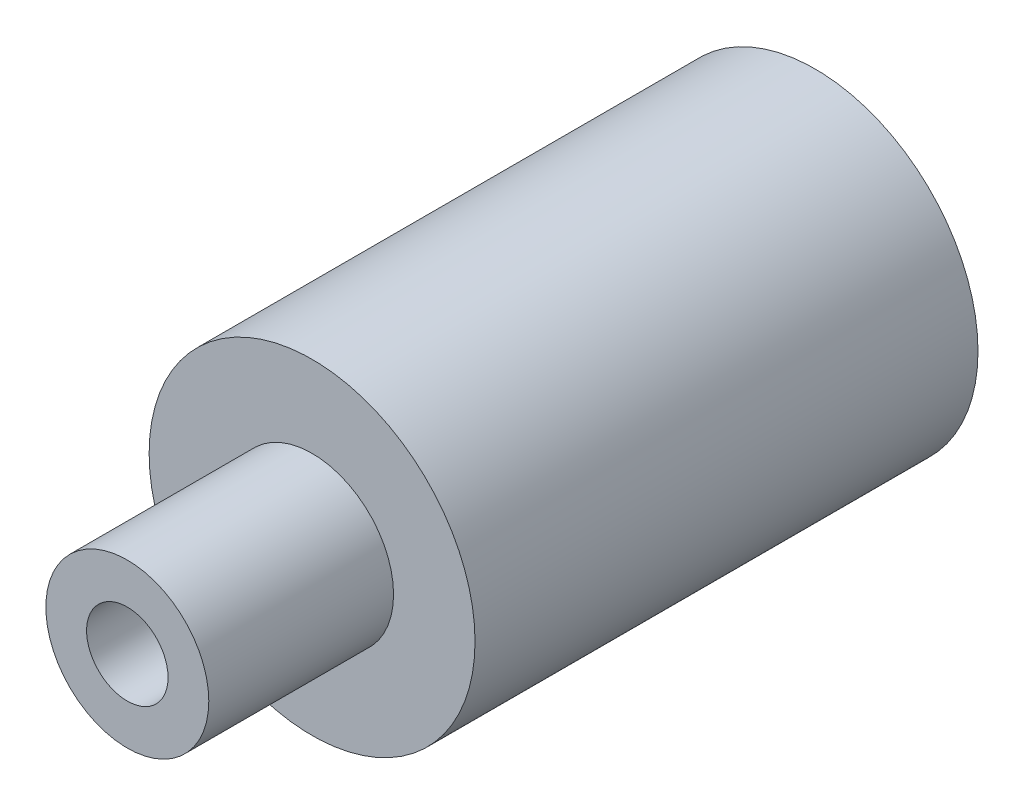
ISO-10303-21;
HEADER;
FILE_DESCRIPTION(('STEP AP214'),'2;1');
FILE_NAME('part.step','',(''),(''),'','','');
FILE_SCHEMA(('AUTOMOTIVE_DESIGN { 1 0 10303 214 1 1 1 1 }'));
ENDSEC;
DATA;
#1=APPLICATION_CONTEXT('core data for automotive mechanical design processes');
#2=APPLICATION_PROTOCOL_DEFINITION('international standard','automotive_design',2000,#1);
#3=PRODUCT_CONTEXT('',#1,'mechanical');
#4=PRODUCT('Part','Part','',(#3));
#5=PRODUCT_RELATED_PRODUCT_CATEGORY('part','',(#4));
#6=PRODUCT_DEFINITION_FORMATION('','',#4);
#7=PRODUCT_DEFINITION_CONTEXT('part definition',#1,'design');
#8=PRODUCT_DEFINITION('design','',#6,#7);
#9=PRODUCT_DEFINITION_SHAPE('','',#8);
#10=(LENGTH_UNIT() NAMED_UNIT(*) SI_UNIT(.MILLI.,.METRE.));
#11=(NAMED_UNIT(*) PLANE_ANGLE_UNIT() SI_UNIT($,.RADIAN.));
#12=(NAMED_UNIT(*) SI_UNIT($,.STERADIAN.) SOLID_ANGLE_UNIT());
#13=UNCERTAINTY_MEASURE_WITH_UNIT(LENGTH_MEASURE(1.E-05),#10,'distance_accuracy_value','');
#14=(GEOMETRIC_REPRESENTATION_CONTEXT(3) GLOBAL_UNCERTAINTY_ASSIGNED_CONTEXT((#13)) GLOBAL_UNIT_ASSIGNED_CONTEXT((#10,
#11,#12)) REPRESENTATION_CONTEXT('',''));
#15=CARTESIAN_POINT('',(0.,0.,0.));
#16=DIRECTION('',(0.,0.,1.));
#17=DIRECTION('',(1.,0.,0.));
#18=AXIS2_PLACEMENT_3D('',#15,#16,#17);
#19=CARTESIAN_POINT('',(0.,0.,0.));
#20=DIRECTION('',(0.,0.,-1.));
#21=DIRECTION('',(-1.,0.,0.));
#22=AXIS2_PLACEMENT_3D('',#19,#20,#21);
#23=PLANE('',#22);
#24=CARTESIAN_POINT('',(0.,0.,0.));
#25=DIRECTION('',(0.,0.,1.));
#26=DIRECTION('',(1.,0.,0.));
#27=AXIS2_PLACEMENT_3D('',#24,#25,#26);
#28=CIRCLE('',#27,3.175);
#29=CARTESIAN_POINT('',(3.175,0.,0.));
#30=VERTEX_POINT('',#29);
#31=EDGE_CURVE('E50',#30,#30,#28,.T.);
#32=ORIENTED_EDGE('',*,*,#31,.F.);
#33=EDGE_LOOP('',(#32));
#34=FACE_BOUND('',#33,.T.);
#35=CARTESIAN_POINT('',(0.,0.,0.));
#36=DIRECTION('',(0.,0.,1.));
#37=DIRECTION('',(1.,0.,0.));
#38=AXIS2_PLACEMENT_3D('',#35,#36,#37);
#39=CIRCLE('',#38,6.35);
#40=CARTESIAN_POINT('',(6.35,0.,0.));
#41=VERTEX_POINT('',#40);
#42=EDGE_CURVE('E10',#41,#41,#39,.T.);
#43=ORIENTED_EDGE('',*,*,#42,.T.);
#44=EDGE_LOOP('',(#43));
#45=FACE_BOUND('',#44,.T.);
#46=ADVANCED_FACE('F30',(#34,#45),#23,.F.);
#47=CARTESIAN_POINT('',(0.,0.,0.));
#48=DIRECTION('',(0.,0.,1.));
#49=DIRECTION('',(1.,0.,0.));
#50=AXIS2_PLACEMENT_3D('',#47,#48,#49);
#51=CYLINDRICAL_SURFACE('',#50,6.35);
#52=ORIENTED_EDGE('',*,*,#42,.F.);
#53=EDGE_LOOP('',(#52));
#54=FACE_BOUND('',#53,.T.);
#55=CARTESIAN_POINT('',(0.,0.,-14.4));
#56=DIRECTION('',(0.,0.,1.));
#57=DIRECTION('',(1.,0.,0.));
#58=AXIS2_PLACEMENT_3D('',#55,#56,#57);
#59=CIRCLE('',#58,6.35);
#60=CARTESIAN_POINT('',(6.35,0.,-14.4));
#61=VERTEX_POINT('',#60);
#62=EDGE_CURVE('E36',#61,#61,#59,.T.);
#63=ORIENTED_EDGE('',*,*,#62,.T.);
#64=EDGE_LOOP('',(#63));
#65=FACE_BOUND('',#64,.T.);
#66=ADVANCED_FACE('F86',(#54,#65),#51,.T.);
#67=CARTESIAN_POINT('',(0.,6.35,-14.4));
#68=DIRECTION('',(0.,0.,-1.));
#69=DIRECTION('',(-1.,0.,0.));
#70=AXIS2_PLACEMENT_3D('',#67,#68,#69);
#71=PLANE('',#70);
#72=ORIENTED_EDGE('',*,*,#62,.F.);
#73=EDGE_LOOP('',(#72));
#74=FACE_BOUND('',#73,.T.);
#75=CARTESIAN_POINT('',(0.,0.,-14.4));
#76=DIRECTION('',(0.,0.,1.));
#77=DIRECTION('',(1.,0.,0.));
#78=AXIS2_PLACEMENT_3D('',#75,#76,#77);
#79=CIRCLE('',#78,12.7);
#80=CARTESIAN_POINT('',(12.7,0.,-14.4));
#81=VERTEX_POINT('',#80);
#82=EDGE_CURVE('E40',#81,#81,#79,.T.);
#83=ORIENTED_EDGE('',*,*,#82,.T.);
#84=EDGE_LOOP('',(#83));
#85=FACE_BOUND('',#84,.T.);
#86=ADVANCED_FACE('F80',(#74,#85),#71,.F.);
#87=CARTESIAN_POINT('',(0.,0.,0.));
#88=DIRECTION('',(0.,0.,1.));
#89=DIRECTION('',(1.,0.,0.));
#90=AXIS2_PLACEMENT_3D('',#87,#88,#89);
#91=CYLINDRICAL_SURFACE('',#90,12.7);
#92=ORIENTED_EDGE('',*,*,#82,.F.);
#93=EDGE_LOOP('',(#92));
#94=FACE_BOUND('',#93,.T.);
#95=CARTESIAN_POINT('',(0.,0.,-53.6));
#96=DIRECTION('',(0.,0.,1.));
#97=DIRECTION('',(1.,0.,0.));
#98=AXIS2_PLACEMENT_3D('',#95,#96,#97);
#99=CIRCLE('',#98,12.7);
#100=CARTESIAN_POINT('',(12.7,0.,-53.6));
#101=VERTEX_POINT('',#100);
#102=EDGE_CURVE('E44',#101,#101,#99,.T.);
#103=ORIENTED_EDGE('',*,*,#102,.T.);
#104=EDGE_LOOP('',(#103));
#105=FACE_BOUND('',#104,.T.);
#106=ADVANCED_FACE('F75',(#94,#105),#91,.T.);
#107=CARTESIAN_POINT('',(0.,12.7,-53.6));
#108=DIRECTION('',(0.,0.,1.));
#109=DIRECTION('',(1.,0.,0.));
#110=AXIS2_PLACEMENT_3D('',#107,#108,#109);
#111=PLANE('',#110);
#112=CARTESIAN_POINT('',(0.,0.,-53.6));
#113=DIRECTION('',(0.,0.,-1.));
#114=DIRECTION('',(-1.,0.,0.));
#115=AXIS2_PLACEMENT_3D('',#112,#113,#114);
#116=CIRCLE('',#115,6.35);
#117=CARTESIAN_POINT('',(-6.35,0.,-53.6));
#118=VERTEX_POINT('',#117);
#119=EDGE_CURVE('E56',#118,#118,#116,.T.);
#120=ORIENTED_EDGE('',*,*,#119,.F.);
#121=EDGE_LOOP('',(#120));
#122=FACE_BOUND('',#121,.T.);
#123=ORIENTED_EDGE('',*,*,#102,.F.);
#124=EDGE_LOOP('',(#123));
#125=FACE_BOUND('',#124,.T.);
#126=ADVANCED_FACE('F71',(#122,#125),#111,.F.);
#127=CARTESIAN_POINT('',(0.,0.,-25.));
#128=DIRECTION('',(0.,0.,1.));
#129=DIRECTION('',(1.,0.,0.));
#130=AXIS2_PLACEMENT_3D('',#127,#128,#129);
#131=CYLINDRICAL_SURFACE('',#130,3.175);
#132=CARTESIAN_POINT('',(0.,0.,-25.));
#133=DIRECTION('',(0.,0.,1.));
#134=DIRECTION('',(1.,0.,0.));
#135=AXIS2_PLACEMENT_3D('',#132,#133,#134);
#136=CIRCLE('',#135,3.175);
#137=CARTESIAN_POINT('',(3.175,0.,-25.));
#138=VERTEX_POINT('',#137);
#139=EDGE_CURVE('E49',#138,#138,#136,.T.);
#140=ORIENTED_EDGE('',*,*,#139,.F.);
#141=EDGE_LOOP('',(#140));
#142=FACE_BOUND('',#141,.T.);
#143=ORIENTED_EDGE('',*,*,#31,.T.);
#144=EDGE_LOOP('',(#143));
#145=FACE_BOUND('',#144,.T.);
#146=ADVANCED_FACE('F74',(#142,#145),#131,.F.);
#147=CARTESIAN_POINT('',(0.,0.,-25.));
#148=DIRECTION('',(0.,0.,1.));
#149=DIRECTION('',(1.,0.,0.));
#150=AXIS2_PLACEMENT_3D('',#147,#148,#149);
#151=PLANE('',#150);
#152=ORIENTED_EDGE('',*,*,#139,.T.);
#153=EDGE_LOOP('',(#152));
#154=FACE_BOUND('',#153,.T.);
#155=ADVANCED_FACE('F67',(#154),#151,.T.);
#156=CARTESIAN_POINT('',(0.,0.,-28.6));
#157=DIRECTION('',(0.,0.,-1.));
#158=DIRECTION('',(-1.,0.,0.));
#159=AXIS2_PLACEMENT_3D('',#156,#157,#158);
#160=CYLINDRICAL_SURFACE('',#159,6.35);
#161=CARTESIAN_POINT('',(0.,0.,-28.6));
#162=DIRECTION('',(0.,0.,-1.));
#163=DIRECTION('',(-1.,0.,0.));
#164=AXIS2_PLACEMENT_3D('',#161,#162,#163);
#165=CIRCLE('',#164,6.35);
#166=CARTESIAN_POINT('',(-6.35,0.,-28.6));
#167=VERTEX_POINT('',#166);
#168=EDGE_CURVE('E53',#167,#167,#165,.T.);
#169=ORIENTED_EDGE('',*,*,#168,.F.);
#170=EDGE_LOOP('',(#169));
#171=FACE_BOUND('',#170,.T.);
#172=ORIENTED_EDGE('',*,*,#119,.T.);
#173=EDGE_LOOP('',(#172));
#174=FACE_BOUND('',#173,.T.);
#175=ADVANCED_FACE('F64',(#171,#174),#160,.F.);
#176=CARTESIAN_POINT('',(0.,0.,-28.6));
#177=DIRECTION('',(0.,0.,-1.));
#178=DIRECTION('',(-1.,0.,0.));
#179=AXIS2_PLACEMENT_3D('',#176,#177,#178);
#180=PLANE('',#179);
#181=ORIENTED_EDGE('',*,*,#168,.T.);
#182=EDGE_LOOP('',(#181));
#183=FACE_BOUND('',#182,.T.);
#184=ADVANCED_FACE('F62',(#183),#180,.T.);
#185=CLOSED_SHELL('',(#46,#66,#86,#106,#126,#146,#155,#175,#184));
#186=MANIFOLD_SOLID_BREP('B2',#185);
#187=ADVANCED_BREP_SHAPE_REPRESENTATION('',(#18,#186),#14);
#188=SHAPE_DEFINITION_REPRESENTATION(#9,#187);
ENDSEC;
END-ISO-10303-21;
